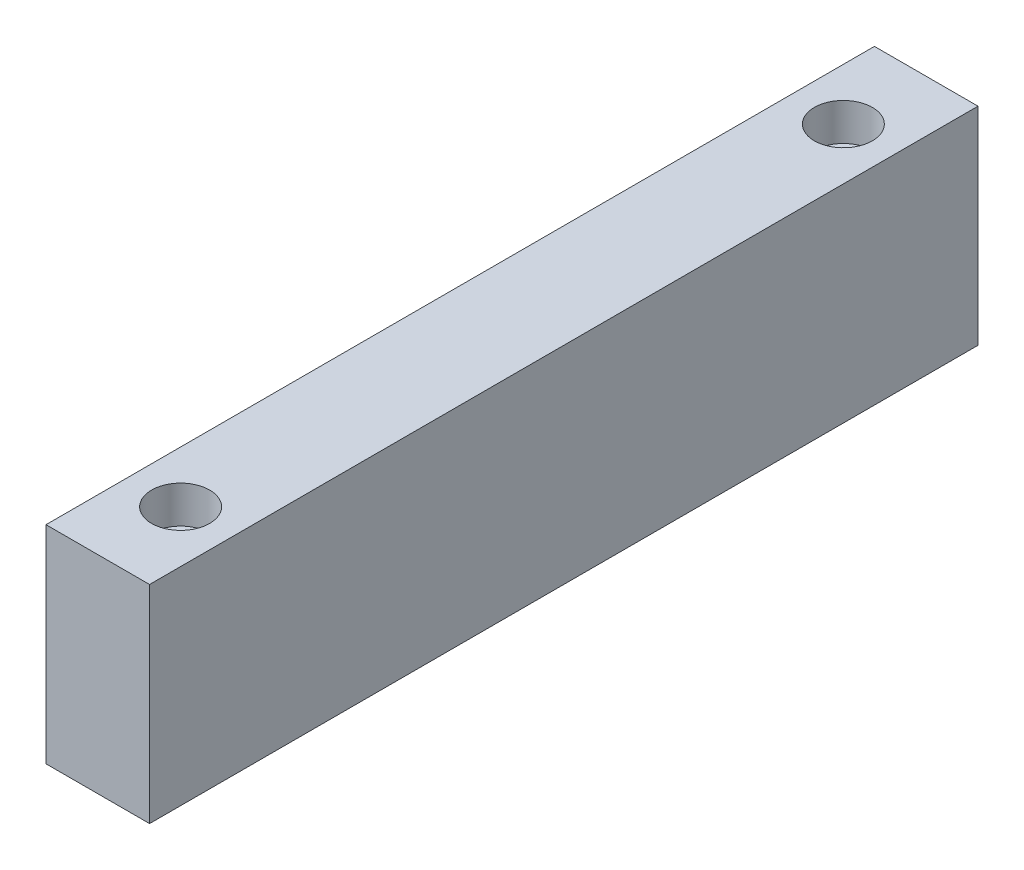
ISO-10303-21;
HEADER;
FILE_DESCRIPTION(('STEP AP214'),'2;1');
FILE_NAME('part.step','',(''),(''),'','','');
FILE_SCHEMA(('AUTOMOTIVE_DESIGN { 1 0 10303 214 1 1 1 1 }'));
ENDSEC;
DATA;
#1=APPLICATION_CONTEXT('core data for automotive mechanical design processes');
#2=APPLICATION_PROTOCOL_DEFINITION('international standard','automotive_design',2000,#1);
#3=PRODUCT_CONTEXT('',#1,'mechanical');
#4=PRODUCT('Part','Part','',(#3));
#5=PRODUCT_RELATED_PRODUCT_CATEGORY('part','',(#4));
#6=PRODUCT_DEFINITION_FORMATION('','',#4);
#7=PRODUCT_DEFINITION_CONTEXT('part definition',#1,'design');
#8=PRODUCT_DEFINITION('design','',#6,#7);
#9=PRODUCT_DEFINITION_SHAPE('','',#8);
#10=(LENGTH_UNIT() NAMED_UNIT(*) SI_UNIT(.MILLI.,.METRE.));
#11=(NAMED_UNIT(*) PLANE_ANGLE_UNIT() SI_UNIT($,.RADIAN.));
#12=(NAMED_UNIT(*) SI_UNIT($,.STERADIAN.) SOLID_ANGLE_UNIT());
#13=UNCERTAINTY_MEASURE_WITH_UNIT(LENGTH_MEASURE(1.E-05),#10,'distance_accuracy_value','');
#14=(GEOMETRIC_REPRESENTATION_CONTEXT(3) GLOBAL_UNCERTAINTY_ASSIGNED_CONTEXT((#13)) GLOBAL_UNIT_ASSIGNED_CONTEXT((#10,
#11,#12)) REPRESENTATION_CONTEXT('',''));
#15=CARTESIAN_POINT('',(0.,0.,0.));
#16=DIRECTION('',(0.,0.,1.));
#17=DIRECTION('',(1.,0.,0.));
#18=AXIS2_PLACEMENT_3D('',#15,#16,#17);
#19=CARTESIAN_POINT('',(25.,50.,100.));
#20=DIRECTION('',(0.,0.,-1.));
#21=DIRECTION('',(0.,1.,0.));
#22=AXIS2_PLACEMENT_3D('',#19,#20,#21);
#23=PLANE('',#22);
#24=DIRECTION('',(0.,-1.,0.));
#25=VECTOR('',#24,1.);
#26=CARTESIAN_POINT('',(0.,50.,100.));
#27=LINE('',#26,#25);
#28=CARTESIAN_POINT('',(0.,50.,100.));
#29=VERTEX_POINT('',#28);
#30=CARTESIAN_POINT('',(0.,0.,100.));
#31=VERTEX_POINT('',#30);
#32=EDGE_CURVE('E95',#29,#31,#27,.T.);
#33=ORIENTED_EDGE('',*,*,#32,.T.);
#34=DIRECTION('',(-1.,0.,0.));
#35=VECTOR('',#34,1.);
#36=CARTESIAN_POINT('',(25.,0.,100.));
#37=LINE('',#36,#35);
#38=CARTESIAN_POINT('',(25.,0.,100.));
#39=VERTEX_POINT('',#38);
#40=EDGE_CURVE('E11',#39,#31,#37,.T.);
#41=ORIENTED_EDGE('',*,*,#40,.F.);
#42=DIRECTION('',(0.,-1.,0.));
#43=VECTOR('',#42,1.);
#44=CARTESIAN_POINT('',(25.,50.,100.));
#45=LINE('',#44,#43);
#46=CARTESIAN_POINT('',(25.,50.,100.));
#47=VERTEX_POINT('',#46);
#48=EDGE_CURVE('E83',#47,#39,#45,.T.);
#49=ORIENTED_EDGE('',*,*,#48,.F.);
#50=DIRECTION('',(-1.,0.,0.));
#51=VECTOR('',#50,1.);
#52=CARTESIAN_POINT('',(25.,50.,100.));
#53=LINE('',#52,#51);
#54=EDGE_CURVE('E91',#47,#29,#53,.T.);
#55=ORIENTED_EDGE('',*,*,#54,.T.);
#56=EDGE_LOOP('',(#33,#41,#49,#55));
#57=FACE_BOUND('',#56,.T.);
#58=ADVANCED_FACE('F32',(#57),#23,.F.);
#59=CARTESIAN_POINT('',(25.,0.,100.));
#60=DIRECTION('',(0.,1.,0.));
#61=DIRECTION('',(0.,0.,1.));
#62=AXIS2_PLACEMENT_3D('',#59,#60,#61);
#63=PLANE('',#62);
#64=CARTESIAN_POINT('',(12.5,0.,80.));
#65=DIRECTION('',(0.,1.,0.));
#66=DIRECTION('',(0.,0.,1.));
#67=AXIS2_PLACEMENT_3D('',#64,#65,#66);
#68=CIRCLE('',#67,4.49999999999999);
#69=CARTESIAN_POINT('',(12.5,0.,84.5));
#70=VERTEX_POINT('',#69);
#71=EDGE_CURVE('E120',#70,#70,#68,.T.);
#72=ORIENTED_EDGE('',*,*,#71,.T.);
#73=EDGE_LOOP('',(#72));
#74=FACE_BOUND('',#73,.T.);
#75=CARTESIAN_POINT('',(12.5,0.,-80.));
#76=DIRECTION('',(0.,1.,0.));
#77=DIRECTION('',(0.,0.,1.));
#78=AXIS2_PLACEMENT_3D('',#75,#76,#77);
#79=CIRCLE('',#78,4.49999999999999);
#80=CARTESIAN_POINT('',(12.5,0.,-75.5));
#81=VERTEX_POINT('',#80);
#82=EDGE_CURVE('E98',#81,#81,#79,.T.);
#83=ORIENTED_EDGE('',*,*,#82,.T.);
#84=EDGE_LOOP('',(#83));
#85=FACE_BOUND('',#84,.T.);
#86=DIRECTION('',(0.,0.,-1.));
#87=VECTOR('',#86,1.);
#88=CARTESIAN_POINT('',(0.,0.,100.));
#89=LINE('',#88,#87);
#90=CARTESIAN_POINT('',(0.,0.,-100.));
#91=VERTEX_POINT('',#90);
#92=EDGE_CURVE('E87',#31,#91,#89,.T.);
#93=ORIENTED_EDGE('',*,*,#92,.T.);
#94=DIRECTION('',(-1.,0.,0.));
#95=VECTOR('',#94,1.);
#96=CARTESIAN_POINT('',(25.,0.,-100.));
#97=LINE('',#96,#95);
#98=CARTESIAN_POINT('',(25.,0.,-100.));
#99=VERTEX_POINT('',#98);
#100=EDGE_CURVE('E40',#99,#91,#97,.T.);
#101=ORIENTED_EDGE('',*,*,#100,.F.);
#102=DIRECTION('',(0.,0.,-1.));
#103=VECTOR('',#102,1.);
#104=CARTESIAN_POINT('',(25.,0.,100.));
#105=LINE('',#104,#103);
#106=EDGE_CURVE('E78',#39,#99,#105,.T.);
#107=ORIENTED_EDGE('',*,*,#106,.F.);
#108=ORIENTED_EDGE('',*,*,#40,.T.);
#109=EDGE_LOOP('',(#93,#101,#107,#108));
#110=FACE_BOUND('',#109,.T.);
#111=ADVANCED_FACE('F86',(#74,#85,#110),#63,.F.);
#112=CARTESIAN_POINT('',(25.,50.,-100.));
#113=DIRECTION('',(0.,0.,1.));
#114=DIRECTION('',(0.,-1.,0.));
#115=AXIS2_PLACEMENT_3D('',#112,#113,#114);
#116=PLANE('',#115);
#117=DIRECTION('',(0.,1.,0.));
#118=VECTOR('',#117,1.);
#119=CARTESIAN_POINT('',(0.,50.,-100.));
#120=LINE('',#119,#118);
#121=CARTESIAN_POINT('',(0.,50.,-100.));
#122=VERTEX_POINT('',#121);
#123=EDGE_CURVE('E65',#91,#122,#120,.T.);
#124=ORIENTED_EDGE('',*,*,#123,.T.);
#125=DIRECTION('',(-1.,0.,0.));
#126=VECTOR('',#125,1.);
#127=CARTESIAN_POINT('',(25.,50.,-100.));
#128=LINE('',#127,#126);
#129=CARTESIAN_POINT('',(25.,50.,-100.));
#130=VERTEX_POINT('',#129);
#131=EDGE_CURVE('E88',#130,#122,#128,.T.);
#132=ORIENTED_EDGE('',*,*,#131,.F.);
#133=DIRECTION('',(0.,1.,0.));
#134=VECTOR('',#133,1.);
#135=CARTESIAN_POINT('',(25.,50.,-100.));
#136=LINE('',#135,#134);
#137=EDGE_CURVE('E81',#99,#130,#136,.T.);
#138=ORIENTED_EDGE('',*,*,#137,.F.);
#139=ORIENTED_EDGE('',*,*,#100,.T.);
#140=EDGE_LOOP('',(#124,#132,#138,#139));
#141=FACE_BOUND('',#140,.T.);
#142=ADVANCED_FACE('F89',(#141),#116,.F.);
#143=CARTESIAN_POINT('',(25.,50.,100.));
#144=DIRECTION('',(0.,-1.,0.));
#145=DIRECTION('',(0.,0.,-1.));
#146=AXIS2_PLACEMENT_3D('',#143,#144,#145);
#147=PLANE('',#146);
#148=CARTESIAN_POINT('',(12.5,50.,80.));
#149=DIRECTION('',(0.,1.,0.));
#150=DIRECTION('',(0.,0.,1.));
#151=AXIS2_PLACEMENT_3D('',#148,#149,#150);
#152=CIRCLE('',#151,7.);
#153=CARTESIAN_POINT('',(12.5,50.,87.));
#154=VERTEX_POINT('',#153);
#155=EDGE_CURVE('E129',#154,#154,#152,.T.);
#156=ORIENTED_EDGE('',*,*,#155,.F.);
#157=EDGE_LOOP('',(#156));
#158=FACE_BOUND('',#157,.T.);
#159=CARTESIAN_POINT('',(12.5,50.,-80.));
#160=DIRECTION('',(0.,1.,0.));
#161=DIRECTION('',(0.,0.,1.));
#162=AXIS2_PLACEMENT_3D('',#159,#160,#161);
#163=CIRCLE('',#162,7.);
#164=CARTESIAN_POINT('',(12.5,50.,-73.));
#165=VERTEX_POINT('',#164);
#166=EDGE_CURVE('E117',#165,#165,#163,.T.);
#167=ORIENTED_EDGE('',*,*,#166,.F.);
#168=EDGE_LOOP('',(#167));
#169=FACE_BOUND('',#168,.T.);
#170=DIRECTION('',(0.,0.,1.));
#171=VECTOR('',#170,1.);
#172=CARTESIAN_POINT('',(0.,50.,100.));
#173=LINE('',#172,#171);
#174=EDGE_CURVE('E71',#122,#29,#173,.T.);
#175=ORIENTED_EDGE('',*,*,#174,.T.);
#176=ORIENTED_EDGE('',*,*,#54,.F.);
#177=DIRECTION('',(0.,0.,1.));
#178=VECTOR('',#177,1.);
#179=CARTESIAN_POINT('',(25.,50.,100.));
#180=LINE('',#179,#178);
#181=EDGE_CURVE('E48',#130,#47,#180,.T.);
#182=ORIENTED_EDGE('',*,*,#181,.F.);
#183=ORIENTED_EDGE('',*,*,#131,.T.);
#184=EDGE_LOOP('',(#175,#176,#182,#183));
#185=FACE_BOUND('',#184,.T.);
#186=ADVANCED_FACE('F103',(#158,#169,#185),#147,.F.);
#187=CARTESIAN_POINT('',(25.,0.,100.));
#188=DIRECTION('',(1.,0.,0.));
#189=DIRECTION('',(0.,0.,-1.));
#190=AXIS2_PLACEMENT_3D('',#187,#188,#189);
#191=PLANE('',#190);
#192=ORIENTED_EDGE('',*,*,#48,.T.);
#193=ORIENTED_EDGE('',*,*,#106,.T.);
#194=ORIENTED_EDGE('',*,*,#137,.T.);
#195=ORIENTED_EDGE('',*,*,#181,.T.);
#196=EDGE_LOOP('',(#192,#193,#194,#195));
#197=FACE_BOUND('',#196,.T.);
#198=ADVANCED_FACE('F79',(#197),#191,.T.);
#199=CARTESIAN_POINT('',(0.,0.,100.));
#200=DIRECTION('',(1.,0.,0.));
#201=DIRECTION('',(0.,0.,-1.));
#202=AXIS2_PLACEMENT_3D('',#199,#200,#201);
#203=PLANE('',#202);
#204=ORIENTED_EDGE('',*,*,#32,.F.);
#205=ORIENTED_EDGE('',*,*,#174,.F.);
#206=ORIENTED_EDGE('',*,*,#123,.F.);
#207=ORIENTED_EDGE('',*,*,#92,.F.);
#208=EDGE_LOOP('',(#204,#205,#206,#207));
#209=FACE_BOUND('',#208,.T.);
#210=ADVANCED_FACE('F106',(#209),#203,.F.);
#211=CARTESIAN_POINT('',(12.5,50.,-80.));
#212=DIRECTION('',(0.,1.,0.));
#213=DIRECTION('',(0.,0.,1.));
#214=AXIS2_PLACEMENT_3D('',#211,#212,#213);
#215=CYLINDRICAL_SURFACE('',#214,4.5);
#216=ORIENTED_EDGE('',*,*,#82,.F.);
#217=EDGE_LOOP('',(#216));
#218=FACE_BOUND('',#217,.T.);
#219=CARTESIAN_POINT('',(12.5,41.,-80.));
#220=DIRECTION('',(0.,1.,0.));
#221=DIRECTION('',(0.,0.,1.));
#222=AXIS2_PLACEMENT_3D('',#219,#220,#221);
#223=CIRCLE('',#222,4.5);
#224=CARTESIAN_POINT('',(12.5,41.,-75.5));
#225=VERTEX_POINT('',#224);
#226=EDGE_CURVE('E111',#225,#225,#223,.T.);
#227=ORIENTED_EDGE('',*,*,#226,.T.);
#228=EDGE_LOOP('',(#227));
#229=FACE_BOUND('',#228,.T.);
#230=ADVANCED_FACE('F153',(#218,#229),#215,.F.);
#231=CARTESIAN_POINT('',(17.,41.,-80.));
#232=DIRECTION('',(0.,-1.,0.));
#233=DIRECTION('',(0.,0.,-1.));
#234=AXIS2_PLACEMENT_3D('',#231,#232,#233);
#235=PLANE('',#234);
#236=ORIENTED_EDGE('',*,*,#226,.F.);
#237=EDGE_LOOP('',(#236));
#238=FACE_BOUND('',#237,.T.);
#239=CARTESIAN_POINT('',(12.5,41.,-80.));
#240=DIRECTION('',(0.,1.,0.));
#241=DIRECTION('',(0.,0.,1.));
#242=AXIS2_PLACEMENT_3D('',#239,#240,#241);
#243=CIRCLE('',#242,7.);
#244=CARTESIAN_POINT('',(12.5,41.,-73.));
#245=VERTEX_POINT('',#244);
#246=EDGE_CURVE('E114',#245,#245,#243,.T.);
#247=ORIENTED_EDGE('',*,*,#246,.T.);
#248=EDGE_LOOP('',(#247));
#249=FACE_BOUND('',#248,.T.);
#250=ADVANCED_FACE('F143',(#238,#249),#235,.F.);
#251=CARTESIAN_POINT('',(12.5,50.,-80.));
#252=DIRECTION('',(0.,1.,0.));
#253=DIRECTION('',(0.,0.,1.));
#254=AXIS2_PLACEMENT_3D('',#251,#252,#253);
#255=CYLINDRICAL_SURFACE('',#254,7.);
#256=ORIENTED_EDGE('',*,*,#246,.F.);
#257=EDGE_LOOP('',(#256));
#258=FACE_BOUND('',#257,.T.);
#259=ORIENTED_EDGE('',*,*,#166,.T.);
#260=EDGE_LOOP('',(#259));
#261=FACE_BOUND('',#260,.T.);
#262=ADVANCED_FACE('F140',(#258,#261),#255,.F.);
#263=CARTESIAN_POINT('',(12.5,50.,80.));
#264=DIRECTION('',(0.,1.,0.));
#265=DIRECTION('',(0.,0.,1.));
#266=AXIS2_PLACEMENT_3D('',#263,#264,#265);
#267=CYLINDRICAL_SURFACE('',#266,4.5);
#268=ORIENTED_EDGE('',*,*,#71,.F.);
#269=EDGE_LOOP('',(#268));
#270=FACE_BOUND('',#269,.T.);
#271=CARTESIAN_POINT('',(12.5,41.,80.));
#272=DIRECTION('',(0.,1.,0.));
#273=DIRECTION('',(0.,0.,1.));
#274=AXIS2_PLACEMENT_3D('',#271,#272,#273);
#275=CIRCLE('',#274,4.5);
#276=CARTESIAN_POINT('',(12.5,41.,84.5));
#277=VERTEX_POINT('',#276);
#278=EDGE_CURVE('E123',#277,#277,#275,.T.);
#279=ORIENTED_EDGE('',*,*,#278,.T.);
#280=EDGE_LOOP('',(#279));
#281=FACE_BOUND('',#280,.T.);
#282=ADVANCED_FACE('F142',(#270,#281),#267,.F.);
#283=CARTESIAN_POINT('',(17.,41.,80.));
#284=DIRECTION('',(0.,-1.,0.));
#285=DIRECTION('',(0.,0.,-1.));
#286=AXIS2_PLACEMENT_3D('',#283,#284,#285);
#287=PLANE('',#286);
#288=ORIENTED_EDGE('',*,*,#278,.F.);
#289=EDGE_LOOP('',(#288));
#290=FACE_BOUND('',#289,.T.);
#291=CARTESIAN_POINT('',(12.5,41.,80.));
#292=DIRECTION('',(0.,1.,0.));
#293=DIRECTION('',(0.,0.,1.));
#294=AXIS2_PLACEMENT_3D('',#291,#292,#293);
#295=CIRCLE('',#294,7.);
#296=CARTESIAN_POINT('',(12.5,41.,87.));
#297=VERTEX_POINT('',#296);
#298=EDGE_CURVE('E126',#297,#297,#295,.T.);
#299=ORIENTED_EDGE('',*,*,#298,.T.);
#300=EDGE_LOOP('',(#299));
#301=FACE_BOUND('',#300,.T.);
#302=ADVANCED_FACE('F150',(#290,#301),#287,.F.);
#303=CARTESIAN_POINT('',(12.5,50.,80.));
#304=DIRECTION('',(0.,1.,0.));
#305=DIRECTION('',(0.,0.,1.));
#306=AXIS2_PLACEMENT_3D('',#303,#304,#305);
#307=CYLINDRICAL_SURFACE('',#306,7.);
#308=ORIENTED_EDGE('',*,*,#298,.F.);
#309=EDGE_LOOP('',(#308));
#310=FACE_BOUND('',#309,.T.);
#311=ORIENTED_EDGE('',*,*,#155,.T.);
#312=EDGE_LOOP('',(#311));
#313=FACE_BOUND('',#312,.T.);
#314=ADVANCED_FACE('F133',(#310,#313),#307,.F.);
#315=CLOSED_SHELL('',(#58,#111,#142,#186,#198,#210,#230,#250,#262,#282,#302,#314));
#316=MANIFOLD_SOLID_BREP('B2',#315);
#317=ADVANCED_BREP_SHAPE_REPRESENTATION('',(#18,#316),#14);
#318=SHAPE_DEFINITION_REPRESENTATION(#9,#317);
ENDSEC;
END-ISO-10303-21;
